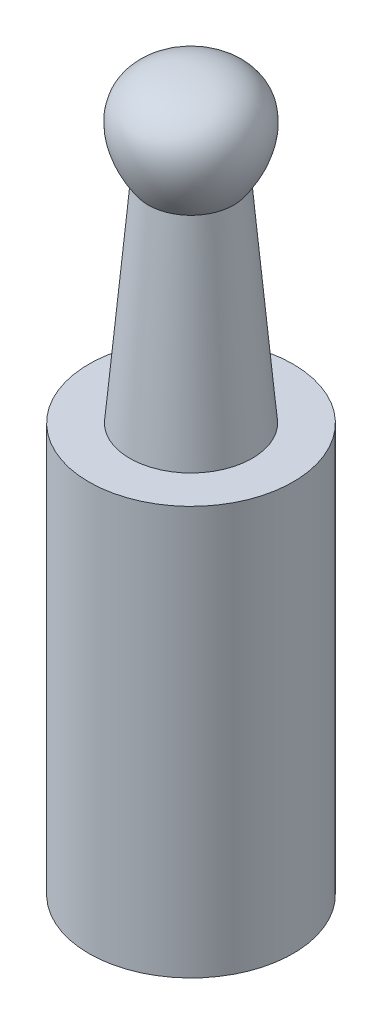
ISO-10303-21;
HEADER;
FILE_DESCRIPTION(('STEP AP214'),'2;1');
FILE_NAME('part.step','',(''),(''),'','','');
FILE_SCHEMA(('AUTOMOTIVE_DESIGN { 1 0 10303 214 1 1 1 1 }'));
ENDSEC;
DATA;
#1=APPLICATION_CONTEXT('core data for automotive mechanical design processes');
#2=APPLICATION_PROTOCOL_DEFINITION('international standard','automotive_design',2000,#1);
#3=PRODUCT_CONTEXT('',#1,'mechanical');
#4=PRODUCT('Part','Part','',(#3));
#5=PRODUCT_RELATED_PRODUCT_CATEGORY('part','',(#4));
#6=PRODUCT_DEFINITION_FORMATION('','',#4);
#7=PRODUCT_DEFINITION_CONTEXT('part definition',#1,'design');
#8=PRODUCT_DEFINITION('design','',#6,#7);
#9=PRODUCT_DEFINITION_SHAPE('','',#8);
#10=(LENGTH_UNIT() NAMED_UNIT(*) SI_UNIT(.MILLI.,.METRE.));
#11=(NAMED_UNIT(*) PLANE_ANGLE_UNIT() SI_UNIT($,.RADIAN.));
#12=(NAMED_UNIT(*) SI_UNIT($,.STERADIAN.) SOLID_ANGLE_UNIT());
#13=UNCERTAINTY_MEASURE_WITH_UNIT(LENGTH_MEASURE(1.E-05),#10,'distance_accuracy_value','');
#14=(GEOMETRIC_REPRESENTATION_CONTEXT(3) GLOBAL_UNCERTAINTY_ASSIGNED_CONTEXT((#13)) GLOBAL_UNIT_ASSIGNED_CONTEXT((#10,
#11,#12)) REPRESENTATION_CONTEXT('',''));
#15=CARTESIAN_POINT('',(0.,0.,0.));
#16=DIRECTION('',(0.,0.,1.));
#17=DIRECTION('',(1.,0.,0.));
#18=AXIS2_PLACEMENT_3D('',#15,#16,#17);
#19=CARTESIAN_POINT('',(0.,2.54,0.));
#20=DIRECTION('',(0.,-1.,0.));
#21=DIRECTION('',(0.,0.,-1.));
#22=AXIS2_PLACEMENT_3D('',#19,#20,#21);
#23=CYLINDRICAL_SURFACE('',#22,0.635);
#24=CARTESIAN_POINT('',(0.,2.54,0.));
#25=DIRECTION('',(0.,1.,0.));
#26=DIRECTION('',(0.,0.,1.));
#27=AXIS2_PLACEMENT_3D('',#24,#25,#26);
#28=CIRCLE('',#27,0.635);
#29=CARTESIAN_POINT('',(0.,2.54,0.635));
#30=VERTEX_POINT('',#29);
#31=EDGE_CURVE('E11',#30,#30,#28,.T.);
#32=ORIENTED_EDGE('',*,*,#31,.F.);
#33=EDGE_LOOP('',(#32));
#34=FACE_BOUND('',#33,.T.);
#35=CARTESIAN_POINT('',(0.,0.,0.));
#36=DIRECTION('',(0.,1.,0.));
#37=DIRECTION('',(0.,0.,1.));
#38=AXIS2_PLACEMENT_3D('',#35,#36,#37);
#39=CIRCLE('',#38,0.635);
#40=CARTESIAN_POINT('',(0.,0.,0.635));
#41=VERTEX_POINT('',#40);
#42=EDGE_CURVE('E40',#41,#41,#39,.T.);
#43=ORIENTED_EDGE('',*,*,#42,.T.);
#44=EDGE_LOOP('',(#43));
#45=FACE_BOUND('',#44,.T.);
#46=ADVANCED_FACE('F37',(#34,#45),#23,.T.);
#47=CARTESIAN_POINT('',(0.,2.54,0.));
#48=DIRECTION('',(0.,1.,0.));
#49=DIRECTION('',(0.,0.,1.));
#50=AXIS2_PLACEMENT_3D('',#47,#48,#49);
#51=PLANE('',#50);
#52=CARTESIAN_POINT('',(0.,2.54,0.));
#53=DIRECTION('',(0.,-1.,0.));
#54=DIRECTION('',(0.,0.,-1.));
#55=AXIS2_PLACEMENT_3D('',#52,#53,#54);
#56=CIRCLE('',#55,0.381);
#57=CARTESIAN_POINT('',(0.,2.54,-0.381));
#58=VERTEX_POINT('',#57);
#59=EDGE_CURVE('E76',#58,#58,#56,.T.);
#60=ORIENTED_EDGE('',*,*,#59,.T.);
#61=EDGE_LOOP('',(#60));
#62=FACE_BOUND('',#61,.T.);
#63=ORIENTED_EDGE('',*,*,#31,.T.);
#64=EDGE_LOOP('',(#63));
#65=FACE_BOUND('',#64,.T.);
#66=ADVANCED_FACE('F58',(#62,#65),#51,.T.);
#67=CARTESIAN_POINT('',(0.,0.,0.));
#68=DIRECTION('',(0.,1.,0.));
#69=DIRECTION('',(0.,0.,1.));
#70=AXIS2_PLACEMENT_3D('',#67,#68,#69);
#71=PLANE('',#70);
#72=ORIENTED_EDGE('',*,*,#42,.F.);
#73=EDGE_LOOP('',(#72));
#74=FACE_BOUND('',#73,.T.);
#75=ADVANCED_FACE('F49',(#74),#71,.F.);
#76=CARTESIAN_POINT('',(0.,4.445,0.));
#77=CARTESIAN_POINT('',(0.,4.445,0.280999382766613));
#78=CARTESIAN_POINT('',(0.,4.24459135122772,0.46120126526062));
#79=CARTESIAN_POINT('',(0.,3.93161016521685,0.32885801045279));
#80=CARTESIAN_POINT('',(0.,3.84697353653154,0.2666546320251));
#81=B_SPLINE_CURVE_WITH_KNOTS('',3,(#76,#77,#78,#79,#80),.UNSPECIFIED.,.F.,.F.,(4,1,4),(0.,
0.688226699974173,1.),.UNSPECIFIED.);
#82=CARTESIAN_POINT('',(0.,2.54,0.));
#83=DIRECTION('',(0.,-1.,0.));
#84=AXIS1_PLACEMENT('',#82,#83);
#85=SURFACE_OF_REVOLUTION('',#81,#84);
#86=CARTESIAN_POINT('',(0.,3.84697353653154,0.));
#87=DIRECTION('',(0.,-1.,0.));
#88=DIRECTION('',(0.,0.,-1.));
#89=AXIS2_PLACEMENT_3D('',#86,#87,#88);
#90=CIRCLE('',#89,0.2666546320251);
#91=CARTESIAN_POINT('',(0.,3.84697353653154,-0.2666546320251));
#92=VERTEX_POINT('',#91);
#93=EDGE_CURVE('E73',#92,#92,#90,.T.);
#94=ORIENTED_EDGE('',*,*,#93,.F.);
#95=EDGE_LOOP('',(#94));
#96=FACE_BOUND('',#95,.T.);
#97=CARTESIAN_POINT('',(0.,4.445,0.));
#98=VERTEX_POINT('',#97);
#99=VERTEX_LOOP('',#98);
#100=FACE_BOUND('',#99,.T.);
#101=ADVANCED_FACE('F46',(#96,#100),#85,.T.);
#102=CARTESIAN_POINT('',(0.,3.84697353653154,0.));
#103=DIRECTION('',(0.,-1.,0.));
#104=DIRECTION('',(0.,0.,-1.));
#105=AXIS2_PLACEMENT_3D('',#102,#103,#104);
#106=CONICAL_SURFACE('',#105,0.2666546320251,0.0872664625997202);
#107=ORIENTED_EDGE('',*,*,#59,.F.);
#108=EDGE_LOOP('',(#107));
#109=FACE_BOUND('',#108,.T.);
#110=ORIENTED_EDGE('',*,*,#93,.T.);
#111=EDGE_LOOP('',(#110));
#112=FACE_BOUND('',#111,.T.);
#113=ADVANCED_FACE('F48',(#109,#112),#106,.T.);
#114=CLOSED_SHELL('',(#46,#66,#75,#101,#113));
#115=MANIFOLD_SOLID_BREP('B2',#114);
#116=ADVANCED_BREP_SHAPE_REPRESENTATION('',(#18,#115),#14);
#117=SHAPE_DEFINITION_REPRESENTATION(#9,#116);
ENDSEC;
END-ISO-10303-21;
